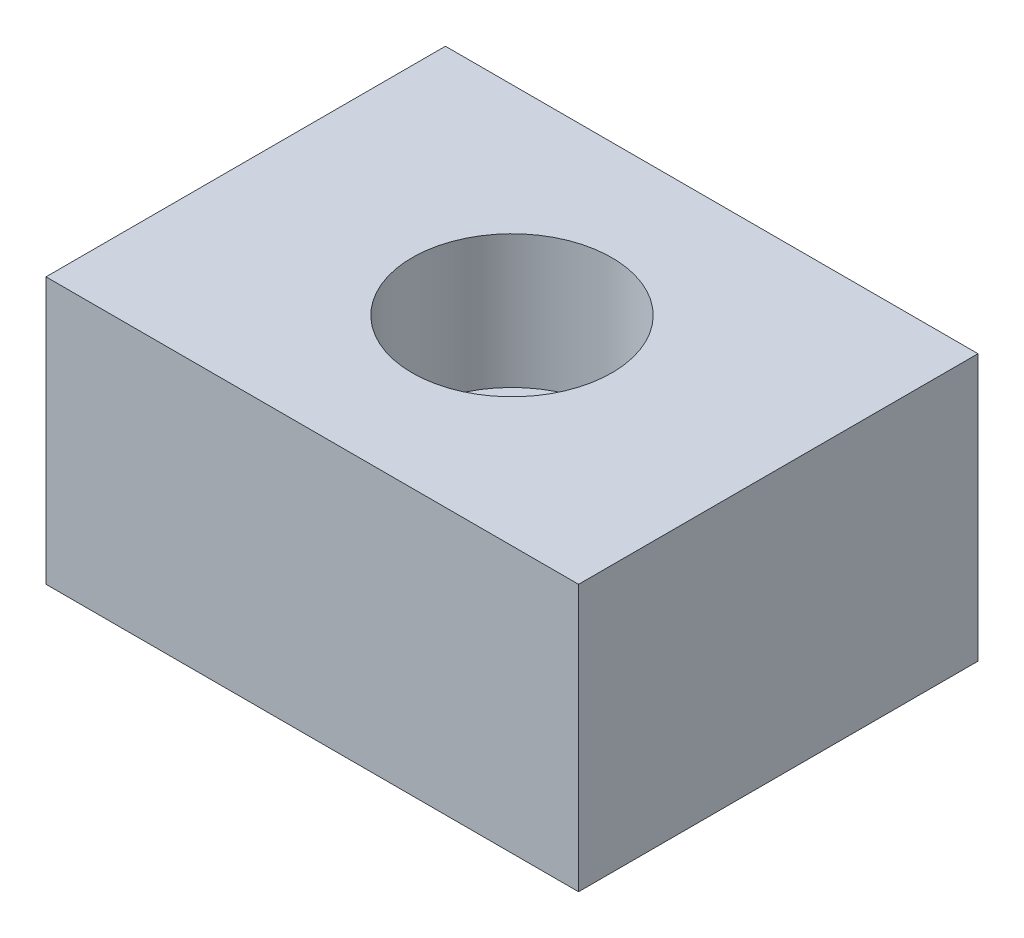
ISO-10303-21;
HEADER;
FILE_DESCRIPTION(('STEP AP214'),'2;1');
FILE_NAME('part.step','',(''),(''),'','','');
FILE_SCHEMA(('AUTOMOTIVE_DESIGN { 1 0 10303 214 1 1 1 1 }'));
ENDSEC;
DATA;
#1=APPLICATION_CONTEXT('core data for automotive mechanical design processes');
#2=APPLICATION_PROTOCOL_DEFINITION('international standard','automotive_design',2000,#1);
#3=PRODUCT_CONTEXT('',#1,'mechanical');
#4=PRODUCT('Part','Part','',(#3));
#5=PRODUCT_RELATED_PRODUCT_CATEGORY('part','',(#4));
#6=PRODUCT_DEFINITION_FORMATION('','',#4);
#7=PRODUCT_DEFINITION_CONTEXT('part definition',#1,'design');
#8=PRODUCT_DEFINITION('design','',#6,#7);
#9=PRODUCT_DEFINITION_SHAPE('','',#8);
#10=(LENGTH_UNIT() NAMED_UNIT(*) SI_UNIT(.MILLI.,.METRE.));
#11=(NAMED_UNIT(*) PLANE_ANGLE_UNIT() SI_UNIT($,.RADIAN.));
#12=(NAMED_UNIT(*) SI_UNIT($,.STERADIAN.) SOLID_ANGLE_UNIT());
#13=UNCERTAINTY_MEASURE_WITH_UNIT(LENGTH_MEASURE(1.E-05),#10,'distance_accuracy_value','');
#14=(GEOMETRIC_REPRESENTATION_CONTEXT(3) GLOBAL_UNCERTAINTY_ASSIGNED_CONTEXT((#13)) GLOBAL_UNIT_ASSIGNED_CONTEXT((#10,
#11,#12)) REPRESENTATION_CONTEXT('',''));
#15=CARTESIAN_POINT('',(0.,0.,0.));
#16=DIRECTION('',(0.,0.,1.));
#17=DIRECTION('',(1.,0.,0.));
#18=AXIS2_PLACEMENT_3D('',#15,#16,#17);
#19=CARTESIAN_POINT('',(12.7,12.7,9.525));
#20=DIRECTION('',(-1.,0.,0.));
#21=DIRECTION('',(0.,0.,1.));
#22=AXIS2_PLACEMENT_3D('',#19,#20,#21);
#23=PLANE('',#22);
#24=DIRECTION('',(0.,0.,-1.));
#25=VECTOR('',#24,1.);
#26=CARTESIAN_POINT('',(12.7,0.,9.525));
#27=LINE('',#26,#25);
#28=CARTESIAN_POINT('',(12.7,0.,9.525));
#29=VERTEX_POINT('',#28);
#30=CARTESIAN_POINT('',(12.7,0.,-9.525));
#31=VERTEX_POINT('',#30);
#32=EDGE_CURVE('E100',#29,#31,#27,.T.);
#33=ORIENTED_EDGE('',*,*,#32,.T.);
#34=DIRECTION('',(0.,-1.,0.));
#35=VECTOR('',#34,1.);
#36=CARTESIAN_POINT('',(12.7,12.7,-9.525));
#37=LINE('',#36,#35);
#38=CARTESIAN_POINT('',(12.7,12.7,-9.525));
#39=VERTEX_POINT('',#38);
#40=EDGE_CURVE('E11',#39,#31,#37,.T.);
#41=ORIENTED_EDGE('',*,*,#40,.F.);
#42=DIRECTION('',(0.,0.,-1.));
#43=VECTOR('',#42,1.);
#44=CARTESIAN_POINT('',(12.7,12.7,9.525));
#45=LINE('',#44,#43);
#46=CARTESIAN_POINT('',(12.7,12.7,9.525));
#47=VERTEX_POINT('',#46);
#48=EDGE_CURVE('E88',#47,#39,#45,.T.);
#49=ORIENTED_EDGE('',*,*,#48,.F.);
#50=DIRECTION('',(0.,-1.,0.));
#51=VECTOR('',#50,1.);
#52=CARTESIAN_POINT('',(12.7,12.7,9.525));
#53=LINE('',#52,#51);
#54=EDGE_CURVE('E96',#47,#29,#53,.T.);
#55=ORIENTED_EDGE('',*,*,#54,.T.);
#56=EDGE_LOOP('',(#33,#41,#49,#55));
#57=FACE_BOUND('',#56,.T.);
#58=ADVANCED_FACE('F37',(#57),#23,.F.);
#59=CARTESIAN_POINT('',(-12.7,12.7,-9.525));
#60=DIRECTION('',(0.,0.,1.));
#61=DIRECTION('',(1.,0.,0.));
#62=AXIS2_PLACEMENT_3D('',#59,#60,#61);
#63=PLANE('',#62);
#64=DIRECTION('',(-1.,0.,0.));
#65=VECTOR('',#64,1.);
#66=CARTESIAN_POINT('',(-12.7,0.,-9.525));
#67=LINE('',#66,#65);
#68=CARTESIAN_POINT('',(-12.7,0.,-9.525));
#69=VERTEX_POINT('',#68);
#70=EDGE_CURVE('E92',#31,#69,#67,.T.);
#71=ORIENTED_EDGE('',*,*,#70,.T.);
#72=DIRECTION('',(0.,-1.,0.));
#73=VECTOR('',#72,1.);
#74=CARTESIAN_POINT('',(-12.7,12.7,-9.525));
#75=LINE('',#74,#73);
#76=CARTESIAN_POINT('',(-12.7,12.7,-9.525));
#77=VERTEX_POINT('',#76);
#78=EDGE_CURVE('E45',#77,#69,#75,.T.);
#79=ORIENTED_EDGE('',*,*,#78,.F.);
#80=DIRECTION('',(-1.,0.,0.));
#81=VECTOR('',#80,1.);
#82=CARTESIAN_POINT('',(-12.7,12.7,-9.525));
#83=LINE('',#82,#81);
#84=EDGE_CURVE('E83',#39,#77,#83,.T.);
#85=ORIENTED_EDGE('',*,*,#84,.F.);
#86=ORIENTED_EDGE('',*,*,#40,.T.);
#87=EDGE_LOOP('',(#71,#79,#85,#86));
#88=FACE_BOUND('',#87,.T.);
#89=ADVANCED_FACE('F91',(#88),#63,.F.);
#90=CARTESIAN_POINT('',(-12.7,12.7,9.525));
#91=DIRECTION('',(1.,0.,0.));
#92=DIRECTION('',(0.,0.,-1.));
#93=AXIS2_PLACEMENT_3D('',#90,#91,#92);
#94=PLANE('',#93);
#95=DIRECTION('',(0.,0.,1.));
#96=VECTOR('',#95,1.);
#97=CARTESIAN_POINT('',(-12.7,0.,9.525));
#98=LINE('',#97,#96);
#99=CARTESIAN_POINT('',(-12.7,0.,9.525));
#100=VERTEX_POINT('',#99);
#101=EDGE_CURVE('E70',#69,#100,#98,.T.);
#102=ORIENTED_EDGE('',*,*,#101,.T.);
#103=DIRECTION('',(0.,-1.,0.));
#104=VECTOR('',#103,1.);
#105=CARTESIAN_POINT('',(-12.7,12.7,9.525));
#106=LINE('',#105,#104);
#107=CARTESIAN_POINT('',(-12.7,12.7,9.525));
#108=VERTEX_POINT('',#107);
#109=EDGE_CURVE('E93',#108,#100,#106,.T.);
#110=ORIENTED_EDGE('',*,*,#109,.F.);
#111=DIRECTION('',(0.,0.,1.));
#112=VECTOR('',#111,1.);
#113=CARTESIAN_POINT('',(-12.7,12.7,9.525));
#114=LINE('',#113,#112);
#115=EDGE_CURVE('E86',#77,#108,#114,.T.);
#116=ORIENTED_EDGE('',*,*,#115,.F.);
#117=ORIENTED_EDGE('',*,*,#78,.T.);
#118=EDGE_LOOP('',(#102,#110,#116,#117));
#119=FACE_BOUND('',#118,.T.);
#120=ADVANCED_FACE('F94',(#119),#94,.F.);
#121=CARTESIAN_POINT('',(-12.7,12.7,9.525));
#122=DIRECTION('',(0.,0.,-1.));
#123=DIRECTION('',(-1.,0.,0.));
#124=AXIS2_PLACEMENT_3D('',#121,#122,#123);
#125=PLANE('',#124);
#126=DIRECTION('',(1.,0.,0.));
#127=VECTOR('',#126,1.);
#128=CARTESIAN_POINT('',(-12.7,0.,9.525));
#129=LINE('',#128,#127);
#130=EDGE_CURVE('E76',#100,#29,#129,.T.);
#131=ORIENTED_EDGE('',*,*,#130,.T.);
#132=ORIENTED_EDGE('',*,*,#54,.F.);
#133=DIRECTION('',(1.,0.,0.));
#134=VECTOR('',#133,1.);
#135=CARTESIAN_POINT('',(-12.7,12.7,9.525));
#136=LINE('',#135,#134);
#137=EDGE_CURVE('E53',#108,#47,#136,.T.);
#138=ORIENTED_EDGE('',*,*,#137,.F.);
#139=ORIENTED_EDGE('',*,*,#109,.T.);
#140=EDGE_LOOP('',(#131,#132,#138,#139));
#141=FACE_BOUND('',#140,.T.);
#142=ADVANCED_FACE('F108',(#141),#125,.F.);
#143=CARTESIAN_POINT('',(0.,12.7,0.));
#144=DIRECTION('',(0.,-1.,0.));
#145=DIRECTION('',(0.,0.,-1.));
#146=AXIS2_PLACEMENT_3D('',#143,#144,#145);
#147=PLANE('',#146);
#148=CARTESIAN_POINT('',(0.,12.7,0.));
#149=DIRECTION('',(0.,1.,0.));
#150=DIRECTION('',(0.,0.,1.));
#151=AXIS2_PLACEMENT_3D('',#148,#149,#150);
#152=CIRCLE('',#151,4.7625);
#153=CARTESIAN_POINT('',(0.,12.7,4.7625));
#154=VERTEX_POINT('',#153);
#155=EDGE_CURVE('E114',#154,#154,#152,.T.);
#156=ORIENTED_EDGE('',*,*,#155,.F.);
#157=EDGE_LOOP('',(#156));
#158=FACE_BOUND('',#157,.T.);
#159=ORIENTED_EDGE('',*,*,#48,.T.);
#160=ORIENTED_EDGE('',*,*,#84,.T.);
#161=ORIENTED_EDGE('',*,*,#115,.T.);
#162=ORIENTED_EDGE('',*,*,#137,.T.);
#163=EDGE_LOOP('',(#159,#160,#161,#162));
#164=FACE_BOUND('',#163,.T.);
#165=ADVANCED_FACE('F84',(#158,#164),#147,.F.);
#166=CARTESIAN_POINT('',(0.,0.,0.));
#167=DIRECTION('',(0.,-1.,0.));
#168=DIRECTION('',(0.,0.,-1.));
#169=AXIS2_PLACEMENT_3D('',#166,#167,#168);
#170=PLANE('',#169);
#171=CARTESIAN_POINT('',(0.,0.,0.));
#172=DIRECTION('',(0.,1.,0.));
#173=DIRECTION('',(0.,0.,1.));
#174=AXIS2_PLACEMENT_3D('',#171,#172,#173);
#175=CIRCLE('',#174,3.81);
#176=CARTESIAN_POINT('',(0.,0.,3.81));
#177=VERTEX_POINT('',#176);
#178=EDGE_CURVE('E117',#177,#177,#175,.T.);
#179=ORIENTED_EDGE('',*,*,#178,.T.);
#180=EDGE_LOOP('',(#179));
#181=FACE_BOUND('',#180,.T.);
#182=ORIENTED_EDGE('',*,*,#32,.F.);
#183=ORIENTED_EDGE('',*,*,#130,.F.);
#184=ORIENTED_EDGE('',*,*,#101,.F.);
#185=ORIENTED_EDGE('',*,*,#70,.F.);
#186=EDGE_LOOP('',(#182,#183,#184,#185));
#187=FACE_BOUND('',#186,.T.);
#188=ADVANCED_FACE('F111',(#181,#187),#170,.T.);
#189=CARTESIAN_POINT('',(0.,6.35,0.));
#190=DIRECTION('',(0.,1.,0.));
#191=DIRECTION('',(0.,0.,1.));
#192=AXIS2_PLACEMENT_3D('',#189,#190,#191);
#193=CYLINDRICAL_SURFACE('',#192,4.7625);
#194=CARTESIAN_POINT('',(0.,6.35,0.));
#195=DIRECTION('',(0.,1.,0.));
#196=DIRECTION('',(0.,0.,1.));
#197=AXIS2_PLACEMENT_3D('',#194,#195,#196);
#198=CIRCLE('',#197,4.7625);
#199=CARTESIAN_POINT('',(0.,6.35,4.7625));
#200=VERTEX_POINT('',#199);
#201=EDGE_CURVE('E103',#200,#200,#198,.T.);
#202=ORIENTED_EDGE('',*,*,#201,.F.);
#203=EDGE_LOOP('',(#202));
#204=FACE_BOUND('',#203,.T.);
#205=ORIENTED_EDGE('',*,*,#155,.T.);
#206=EDGE_LOOP('',(#205));
#207=FACE_BOUND('',#206,.T.);
#208=ADVANCED_FACE('F136',(#204,#207),#193,.F.);
#209=CARTESIAN_POINT('',(0.,6.35,0.));
#210=DIRECTION('',(0.,1.,0.));
#211=DIRECTION('',(0.,0.,1.));
#212=AXIS2_PLACEMENT_3D('',#209,#210,#211);
#213=PLANE('',#212);
#214=CARTESIAN_POINT('',(0.,6.35,0.));
#215=DIRECTION('',(0.,1.,0.));
#216=DIRECTION('',(0.,0.,1.));
#217=AXIS2_PLACEMENT_3D('',#214,#215,#216);
#218=CIRCLE('',#217,3.81);
#219=CARTESIAN_POINT('',(0.,6.35,3.81));
#220=VERTEX_POINT('',#219);
#221=EDGE_CURVE('E120',#220,#220,#218,.T.);
#222=ORIENTED_EDGE('',*,*,#221,.F.);
#223=EDGE_LOOP('',(#222));
#224=FACE_BOUND('',#223,.T.);
#225=ORIENTED_EDGE('',*,*,#201,.T.);
#226=EDGE_LOOP('',(#225));
#227=FACE_BOUND('',#226,.T.);
#228=ADVANCED_FACE('F130',(#224,#227),#213,.T.);
#229=CARTESIAN_POINT('',(0.,0.,0.));
#230=DIRECTION('',(0.,1.,0.));
#231=DIRECTION('',(0.,0.,1.));
#232=AXIS2_PLACEMENT_3D('',#229,#230,#231);
#233=CYLINDRICAL_SURFACE('',#232,3.81);
#234=ORIENTED_EDGE('',*,*,#178,.F.);
#235=EDGE_LOOP('',(#234));
#236=FACE_BOUND('',#235,.T.);
#237=ORIENTED_EDGE('',*,*,#221,.T.);
#238=EDGE_LOOP('',(#237));
#239=FACE_BOUND('',#238,.T.);
#240=ADVANCED_FACE('F127',(#236,#239),#233,.F.);
#241=CLOSED_SHELL('',(#58,#89,#120,#142,#165,#188,#208,#228,#240));
#242=MANIFOLD_SOLID_BREP('B2',#241);
#243=ADVANCED_BREP_SHAPE_REPRESENTATION('',(#18,#242),#14);
#244=SHAPE_DEFINITION_REPRESENTATION(#9,#243);
ENDSEC;
END-ISO-10303-21;
